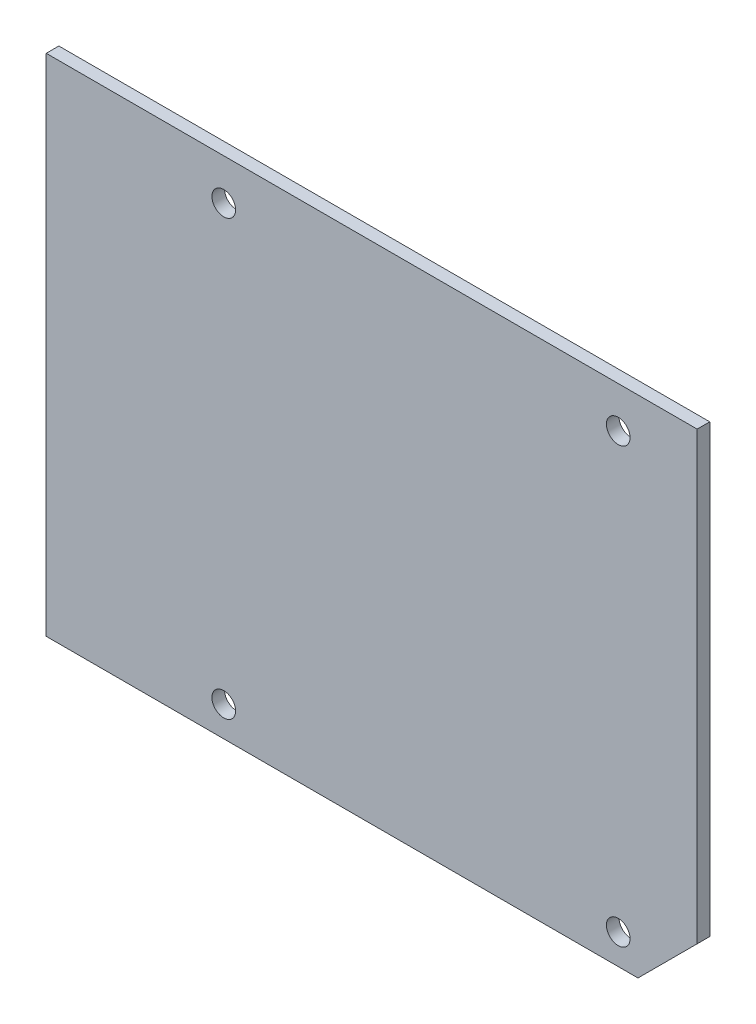
ISO-10303-21;
HEADER;
FILE_DESCRIPTION(('STEP AP214'),'2;1');
FILE_NAME('part.step','',(''),(''),'','','');
FILE_SCHEMA(('AUTOMOTIVE_DESIGN { 1 0 10303 214 1 1 1 1 }'));
ENDSEC;
DATA;
#1=APPLICATION_CONTEXT('core data for automotive mechanical design processes');
#2=APPLICATION_PROTOCOL_DEFINITION('international standard','automotive_design',2000,#1);
#3=PRODUCT_CONTEXT('',#1,'mechanical');
#4=PRODUCT('Part','Part','',(#3));
#5=PRODUCT_RELATED_PRODUCT_CATEGORY('part','',(#4));
#6=PRODUCT_DEFINITION_FORMATION('','',#4);
#7=PRODUCT_DEFINITION_CONTEXT('part definition',#1,'design');
#8=PRODUCT_DEFINITION('design','',#6,#7);
#9=PRODUCT_DEFINITION_SHAPE('','',#8);
#10=(LENGTH_UNIT() NAMED_UNIT(*) SI_UNIT(.MILLI.,.METRE.));
#11=(NAMED_UNIT(*) PLANE_ANGLE_UNIT() SI_UNIT($,.RADIAN.));
#12=(NAMED_UNIT(*) SI_UNIT($,.STERADIAN.) SOLID_ANGLE_UNIT());
#13=UNCERTAINTY_MEASURE_WITH_UNIT(LENGTH_MEASURE(1.E-05),#10,'distance_accuracy_value','');
#14=(GEOMETRIC_REPRESENTATION_CONTEXT(3) GLOBAL_UNCERTAINTY_ASSIGNED_CONTEXT((#13)) GLOBAL_UNIT_ASSIGNED_CONTEXT((#10,
#11,#12)) REPRESENTATION_CONTEXT('',''));
#15=CARTESIAN_POINT('',(0.,0.,0.));
#16=DIRECTION('',(0.,0.,1.));
#17=DIRECTION('',(1.,0.,0.));
#18=AXIS2_PLACEMENT_3D('',#15,#16,#17);
#19=CARTESIAN_POINT('',(41.25,32.,1.6));
#20=DIRECTION('',(0.,0.,1.));
#21=DIRECTION('',(1.,0.,0.));
#22=AXIS2_PLACEMENT_3D('',#19,#20,#21);
#23=PLANE('',#22);
#24=CARTESIAN_POINT('',(72.5,3.8,1.6));
#25=DIRECTION('',(0.,0.,-1.));
#26=DIRECTION('',(-1.,0.,0.));
#27=AXIS2_PLACEMENT_3D('',#24,#25,#26);
#28=CIRCLE('',#27,1.5);
#29=CARTESIAN_POINT('',(71.,3.8,1.6));
#30=VERTEX_POINT('',#29);
#31=EDGE_CURVE('E106',#30,#30,#28,.T.);
#32=ORIENTED_EDGE('',*,*,#31,.T.);
#33=EDGE_LOOP('',(#32));
#34=FACE_BOUND('',#33,.T.);
#35=CARTESIAN_POINT('',(22.5,3.8,1.6));
#36=DIRECTION('',(0.,0.,-1.));
#37=DIRECTION('',(-1.,0.,0.));
#38=AXIS2_PLACEMENT_3D('',#35,#36,#37);
#39=CIRCLE('',#38,1.5);
#40=CARTESIAN_POINT('',(21.,3.8,1.6));
#41=VERTEX_POINT('',#40);
#42=EDGE_CURVE('E109',#41,#41,#39,.T.);
#43=ORIENTED_EDGE('',*,*,#42,.T.);
#44=EDGE_LOOP('',(#43));
#45=FACE_BOUND('',#44,.T.);
#46=CARTESIAN_POINT('',(72.5,58.8,1.6));
#47=DIRECTION('',(0.,0.,-1.));
#48=DIRECTION('',(-1.,0.,0.));
#49=AXIS2_PLACEMENT_3D('',#46,#47,#48);
#50=CIRCLE('',#49,1.5);
#51=CARTESIAN_POINT('',(71.,58.8,1.6));
#52=VERTEX_POINT('',#51);
#53=EDGE_CURVE('E111',#52,#52,#50,.T.);
#54=ORIENTED_EDGE('',*,*,#53,.T.);
#55=EDGE_LOOP('',(#54));
#56=FACE_BOUND('',#55,.T.);
#57=CARTESIAN_POINT('',(22.5,58.8,1.6));
#58=DIRECTION('',(0.,0.,-1.));
#59=DIRECTION('',(-1.,0.,0.));
#60=AXIS2_PLACEMENT_3D('',#57,#58,#59);
#61=CIRCLE('',#60,1.5);
#62=CARTESIAN_POINT('',(21.,58.8,1.6));
#63=VERTEX_POINT('',#62);
#64=EDGE_CURVE('E20',#63,#63,#61,.T.);
#65=ORIENTED_EDGE('',*,*,#64,.T.);
#66=EDGE_LOOP('',(#65));
#67=FACE_BOUND('',#66,.T.);
#68=DIRECTION('',(0.,1.,0.));
#69=VECTOR('',#68,1.);
#70=CARTESIAN_POINT('',(0.,0.,1.6));
#71=LINE('',#70,#69);
#72=CARTESIAN_POINT('',(0.,0.,1.6));
#73=VERTEX_POINT('',#72);
#74=CARTESIAN_POINT('',(0.,64.,1.6));
#75=VERTEX_POINT('',#74);
#76=EDGE_CURVE('E64',#73,#75,#71,.T.);
#77=ORIENTED_EDGE('',*,*,#76,.F.);
#78=DIRECTION('',(1.,0.,0.));
#79=VECTOR('',#78,1.);
#80=CARTESIAN_POINT('',(82.5,0.,1.6));
#81=LINE('',#80,#79);
#82=CARTESIAN_POINT('',(75.,0.,1.6));
#83=VERTEX_POINT('',#82);
#84=EDGE_CURVE('E129',#83,#73,#81,.F.);
#85=ORIENTED_EDGE('',*,*,#84,.F.);
#86=DIRECTION('',(0.707106781186548,0.707106781186548,0.));
#87=VECTOR('',#86,1.);
#88=CARTESIAN_POINT('',(78.75,3.75,1.6));
#89=LINE('',#88,#87);
#90=CARTESIAN_POINT('',(82.5,7.5,1.6));
#91=VERTEX_POINT('',#90);
#92=EDGE_CURVE('E83',#91,#83,#89,.F.);
#93=ORIENTED_EDGE('',*,*,#92,.F.);
#94=DIRECTION('',(0.,1.,0.));
#95=VECTOR('',#94,1.);
#96=CARTESIAN_POINT('',(82.5,64.,1.6));
#97=LINE('',#96,#95);
#98=CARTESIAN_POINT('',(82.5,64.,1.6));
#99=VERTEX_POINT('',#98);
#100=EDGE_CURVE('E79',#99,#91,#97,.F.);
#101=ORIENTED_EDGE('',*,*,#100,.F.);
#102=DIRECTION('',(1.,0.,0.));
#103=VECTOR('',#102,1.);
#104=CARTESIAN_POINT('',(0.,64.,1.6));
#105=LINE('',#104,#103);
#106=EDGE_CURVE('E69',#75,#99,#105,.T.);
#107=ORIENTED_EDGE('',*,*,#106,.F.);
#108=EDGE_LOOP('',(#77,#85,#93,#101,#107));
#109=FACE_BOUND('',#108,.T.);
#110=ADVANCED_FACE('F17',(#34,#45,#56,#67,#109),#23,.T.);
#111=CARTESIAN_POINT('',(82.5,64.,0.));
#112=DIRECTION('',(1.,0.,0.));
#113=DIRECTION('',(0.,0.,-1.));
#114=AXIS2_PLACEMENT_3D('',#111,#112,#113);
#115=PLANE('',#114);
#116=DIRECTION('',(0.,0.,1.));
#117=VECTOR('',#116,1.);
#118=CARTESIAN_POINT('',(82.5,64.,0.));
#119=LINE('',#118,#117);
#120=CARTESIAN_POINT('',(82.5,64.,0.));
#121=VERTEX_POINT('',#120);
#122=EDGE_CURVE('E74',#99,#121,#119,.F.);
#123=ORIENTED_EDGE('',*,*,#122,.F.);
#124=ORIENTED_EDGE('',*,*,#100,.T.);
#125=DIRECTION('',(0.,0.,1.));
#126=VECTOR('',#125,1.);
#127=CARTESIAN_POINT('',(82.5,7.5,0.));
#128=LINE('',#127,#126);
#129=CARTESIAN_POINT('',(82.5,7.5,0.));
#130=VERTEX_POINT('',#129);
#131=EDGE_CURVE('E117',#130,#91,#128,.T.);
#132=ORIENTED_EDGE('',*,*,#131,.F.);
#133=DIRECTION('',(0.,1.,0.));
#134=VECTOR('',#133,1.);
#135=CARTESIAN_POINT('',(82.5,32.,0.));
#136=LINE('',#135,#134);
#137=EDGE_CURVE('E90',#130,#121,#136,.T.);
#138=ORIENTED_EDGE('',*,*,#137,.T.);
#139=EDGE_LOOP('',(#123,#124,#132,#138));
#140=FACE_BOUND('',#139,.T.);
#141=ADVANCED_FACE('F89',(#140),#115,.T.);
#142=CARTESIAN_POINT('',(0.,64.,0.));
#143=DIRECTION('',(0.,1.,0.));
#144=DIRECTION('',(0.,0.,1.));
#145=AXIS2_PLACEMENT_3D('',#142,#143,#144);
#146=PLANE('',#145);
#147=DIRECTION('',(1.,0.,0.));
#148=VECTOR('',#147,1.);
#149=CARTESIAN_POINT('',(41.25,64.,0.));
#150=LINE('',#149,#148);
#151=CARTESIAN_POINT('',(0.,64.,0.));
#152=VERTEX_POINT('',#151);
#153=EDGE_CURVE('E139',#121,#152,#150,.F.);
#154=ORIENTED_EDGE('',*,*,#153,.T.);
#155=DIRECTION('',(0.,0.,1.));
#156=VECTOR('',#155,1.);
#157=CARTESIAN_POINT('',(0.,64.,0.));
#158=LINE('',#157,#156);
#159=EDGE_CURVE('E76',#75,#152,#158,.F.);
#160=ORIENTED_EDGE('',*,*,#159,.F.);
#161=ORIENTED_EDGE('',*,*,#106,.T.);
#162=ORIENTED_EDGE('',*,*,#122,.T.);
#163=EDGE_LOOP('',(#154,#160,#161,#162));
#164=FACE_BOUND('',#163,.T.);
#165=ADVANCED_FACE('F72',(#164),#146,.T.);
#166=CARTESIAN_POINT('',(0.,0.,0.));
#167=DIRECTION('',(-1.,0.,0.));
#168=DIRECTION('',(0.,0.,1.));
#169=AXIS2_PLACEMENT_3D('',#166,#167,#168);
#170=PLANE('',#169);
#171=DIRECTION('',(0.,1.,0.));
#172=VECTOR('',#171,1.);
#173=CARTESIAN_POINT('',(0.,32.,0.));
#174=LINE('',#173,#172);
#175=CARTESIAN_POINT('',(0.,0.,0.));
#176=VERTEX_POINT('',#175);
#177=EDGE_CURVE('E135',#152,#176,#174,.F.);
#178=ORIENTED_EDGE('',*,*,#177,.T.);
#179=DIRECTION('',(0.,0.,-1.));
#180=VECTOR('',#179,1.);
#181=CARTESIAN_POINT('',(0.,0.,0.));
#182=LINE('',#181,#180);
#183=EDGE_CURVE('E127',#73,#176,#182,.T.);
#184=ORIENTED_EDGE('',*,*,#183,.F.);
#185=ORIENTED_EDGE('',*,*,#76,.T.);
#186=ORIENTED_EDGE('',*,*,#159,.T.);
#187=EDGE_LOOP('',(#178,#184,#185,#186));
#188=FACE_BOUND('',#187,.T.);
#189=ADVANCED_FACE('F134',(#188),#170,.T.);
#190=CARTESIAN_POINT('',(82.5,0.,0.));
#191=DIRECTION('',(0.,-1.,0.));
#192=DIRECTION('',(0.,0.,-1.));
#193=AXIS2_PLACEMENT_3D('',#190,#191,#192);
#194=PLANE('',#193);
#195=ORIENTED_EDGE('',*,*,#183,.T.);
#196=DIRECTION('',(1.,0.,0.));
#197=VECTOR('',#196,1.);
#198=CARTESIAN_POINT('',(41.25,0.,0.));
#199=LINE('',#198,#197);
#200=CARTESIAN_POINT('',(75.,0.,0.));
#201=VERTEX_POINT('',#200);
#202=EDGE_CURVE('E141',#176,#201,#199,.T.);
#203=ORIENTED_EDGE('',*,*,#202,.T.);
#204=DIRECTION('',(0.,0.,1.));
#205=VECTOR('',#204,1.);
#206=CARTESIAN_POINT('',(75.,0.,0.));
#207=LINE('',#206,#205);
#208=EDGE_CURVE('E35',#83,#201,#207,.F.);
#209=ORIENTED_EDGE('',*,*,#208,.F.);
#210=ORIENTED_EDGE('',*,*,#84,.T.);
#211=EDGE_LOOP('',(#195,#203,#209,#210));
#212=FACE_BOUND('',#211,.T.);
#213=ADVANCED_FACE('F148',(#212),#194,.T.);
#214=CARTESIAN_POINT('',(78.75,3.75,0.));
#215=DIRECTION('',(0.707106781186548,-0.707106781186548,0.));
#216=DIRECTION('',(0.707106781186548,0.707106781186548,0.));
#217=AXIS2_PLACEMENT_3D('',#214,#215,#216);
#218=PLANE('',#217);
#219=DIRECTION('',(0.707106781186548,0.707106781186547,0.));
#220=VECTOR('',#219,1.);
#221=CARTESIAN_POINT('',(75.,0.,0.));
#222=LINE('',#221,#220);
#223=EDGE_CURVE('E105',#201,#130,#222,.T.);
#224=ORIENTED_EDGE('',*,*,#223,.T.);
#225=ORIENTED_EDGE('',*,*,#131,.T.);
#226=ORIENTED_EDGE('',*,*,#92,.T.);
#227=ORIENTED_EDGE('',*,*,#208,.T.);
#228=EDGE_LOOP('',(#224,#225,#226,#227));
#229=FACE_BOUND('',#228,.T.);
#230=ADVANCED_FACE('F146',(#229),#218,.T.);
#231=CARTESIAN_POINT('',(22.5,58.8,4.));
#232=DIRECTION('',(0.,0.,-1.));
#233=DIRECTION('',(-1.,0.,0.));
#234=AXIS2_PLACEMENT_3D('',#231,#232,#233);
#235=CYLINDRICAL_SURFACE('',#234,1.5);
#236=CARTESIAN_POINT('',(22.5,58.8,0.));
#237=DIRECTION('',(0.,0.,-1.));
#238=DIRECTION('',(-1.,0.,0.));
#239=AXIS2_PLACEMENT_3D('',#236,#237,#238);
#240=CIRCLE('',#239,1.5);
#241=CARTESIAN_POINT('',(21.,58.8,0.));
#242=VERTEX_POINT('',#241);
#243=EDGE_CURVE('E101',#242,#242,#240,.T.);
#244=ORIENTED_EDGE('',*,*,#243,.T.);
#245=EDGE_LOOP('',(#244));
#246=FACE_BOUND('',#245,.T.);
#247=ORIENTED_EDGE('',*,*,#64,.F.);
#248=EDGE_LOOP('',(#247));
#249=FACE_BOUND('',#248,.T.);
#250=ADVANCED_FACE('F156',(#246,#249),#235,.F.);
#251=CARTESIAN_POINT('',(72.5,58.8,4.));
#252=DIRECTION('',(0.,0.,-1.));
#253=DIRECTION('',(-1.,0.,0.));
#254=AXIS2_PLACEMENT_3D('',#251,#252,#253);
#255=CYLINDRICAL_SURFACE('',#254,1.5);
#256=CARTESIAN_POINT('',(72.5,58.8,0.));
#257=DIRECTION('',(0.,0.,-1.));
#258=DIRECTION('',(-1.,0.,0.));
#259=AXIS2_PLACEMENT_3D('',#256,#257,#258);
#260=CIRCLE('',#259,1.5);
#261=CARTESIAN_POINT('',(71.,58.8,0.));
#262=VERTEX_POINT('',#261);
#263=EDGE_CURVE('E98',#262,#262,#260,.T.);
#264=ORIENTED_EDGE('',*,*,#263,.T.);
#265=EDGE_LOOP('',(#264));
#266=FACE_BOUND('',#265,.T.);
#267=ORIENTED_EDGE('',*,*,#53,.F.);
#268=EDGE_LOOP('',(#267));
#269=FACE_BOUND('',#268,.T.);
#270=ADVANCED_FACE('F175',(#266,#269),#255,.F.);
#271=CARTESIAN_POINT('',(22.5,3.8,4.));
#272=DIRECTION('',(0.,0.,-1.));
#273=DIRECTION('',(-1.,0.,0.));
#274=AXIS2_PLACEMENT_3D('',#271,#272,#273);
#275=CYLINDRICAL_SURFACE('',#274,1.5);
#276=CARTESIAN_POINT('',(22.5,3.8,0.));
#277=DIRECTION('',(0.,0.,-1.));
#278=DIRECTION('',(-1.,0.,0.));
#279=AXIS2_PLACEMENT_3D('',#276,#277,#278);
#280=CIRCLE('',#279,1.5);
#281=CARTESIAN_POINT('',(21.,3.8,0.));
#282=VERTEX_POINT('',#281);
#283=EDGE_CURVE('E26',#282,#282,#280,.T.);
#284=ORIENTED_EDGE('',*,*,#283,.T.);
#285=EDGE_LOOP('',(#284));
#286=FACE_BOUND('',#285,.T.);
#287=ORIENTED_EDGE('',*,*,#42,.F.);
#288=EDGE_LOOP('',(#287));
#289=FACE_BOUND('',#288,.T.);
#290=ADVANCED_FACE('F167',(#286,#289),#275,.F.);
#291=CARTESIAN_POINT('',(72.5,3.8,4.));
#292=DIRECTION('',(0.,0.,-1.));
#293=DIRECTION('',(-1.,0.,0.));
#294=AXIS2_PLACEMENT_3D('',#291,#292,#293);
#295=CYLINDRICAL_SURFACE('',#294,1.5);
#296=CARTESIAN_POINT('',(72.5,3.8,0.));
#297=DIRECTION('',(0.,0.,-1.));
#298=DIRECTION('',(-1.,0.,0.));
#299=AXIS2_PLACEMENT_3D('',#296,#297,#298);
#300=CIRCLE('',#299,1.5);
#301=CARTESIAN_POINT('',(71.,3.8,0.));
#302=VERTEX_POINT('',#301);
#303=EDGE_CURVE('E11',#302,#302,#300,.T.);
#304=ORIENTED_EDGE('',*,*,#303,.T.);
#305=EDGE_LOOP('',(#304));
#306=FACE_BOUND('',#305,.T.);
#307=ORIENTED_EDGE('',*,*,#31,.F.);
#308=EDGE_LOOP('',(#307));
#309=FACE_BOUND('',#308,.T.);
#310=ADVANCED_FACE('F160',(#306,#309),#295,.F.);
#311=CARTESIAN_POINT('',(41.25,32.,0.));
#312=DIRECTION('',(0.,0.,1.));
#313=DIRECTION('',(1.,0.,0.));
#314=AXIS2_PLACEMENT_3D('',#311,#312,#313);
#315=PLANE('',#314);
#316=ORIENTED_EDGE('',*,*,#303,.F.);
#317=EDGE_LOOP('',(#316));
#318=FACE_BOUND('',#317,.T.);
#319=ORIENTED_EDGE('',*,*,#283,.F.);
#320=EDGE_LOOP('',(#319));
#321=FACE_BOUND('',#320,.T.);
#322=ORIENTED_EDGE('',*,*,#263,.F.);
#323=EDGE_LOOP('',(#322));
#324=FACE_BOUND('',#323,.T.);
#325=ORIENTED_EDGE('',*,*,#243,.F.);
#326=EDGE_LOOP('',(#325));
#327=FACE_BOUND('',#326,.T.);
#328=ORIENTED_EDGE('',*,*,#202,.F.);
#329=ORIENTED_EDGE('',*,*,#177,.F.);
#330=ORIENTED_EDGE('',*,*,#153,.F.);
#331=ORIENTED_EDGE('',*,*,#137,.F.);
#332=ORIENTED_EDGE('',*,*,#223,.F.);
#333=EDGE_LOOP('',(#328,#329,#330,#331,#332));
#334=FACE_BOUND('',#333,.T.);
#335=ADVANCED_FACE('F138',(#318,#321,#324,#327,#334),#315,.F.);
#336=CLOSED_SHELL('',(#110,#141,#165,#189,#213,#230,#250,#270,#290,#310,#335));
#337=MANIFOLD_SOLID_BREP('B1',#336);
#338=ADVANCED_BREP_SHAPE_REPRESENTATION('',(#18,#337),#14);
#339=SHAPE_DEFINITION_REPRESENTATION(#9,#338);
ENDSEC;
END-ISO-10303-21;
